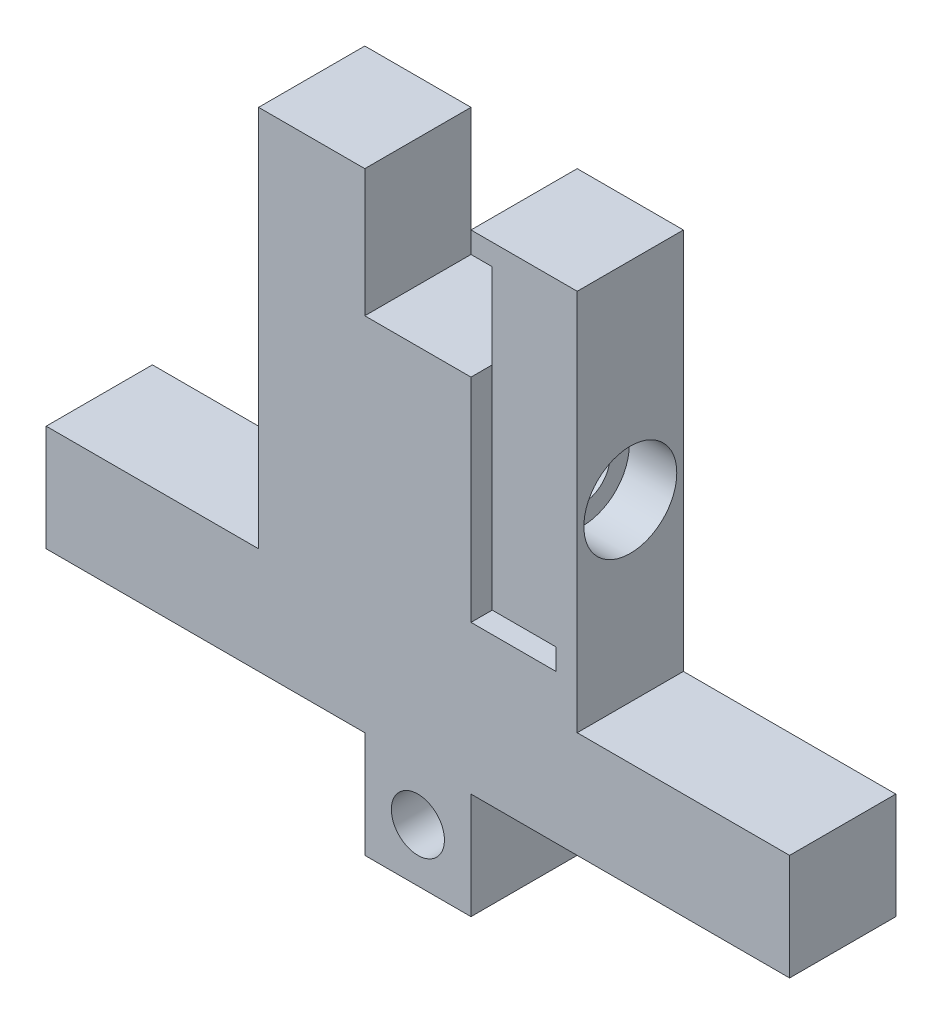
ISO-10303-21;
HEADER;
FILE_DESCRIPTION(('STEP AP214'),'2;1');
FILE_NAME('part.step','',(''),(''),'','','');
FILE_SCHEMA(('AUTOMOTIVE_DESIGN { 1 0 10303 214 1 1 1 1 }'));
ENDSEC;
DATA;
#1=APPLICATION_CONTEXT('core data for automotive mechanical design processes');
#2=APPLICATION_PROTOCOL_DEFINITION('international standard','automotive_design',2000,#1);
#3=PRODUCT_CONTEXT('',#1,'mechanical');
#4=PRODUCT('Part','Part','',(#3));
#5=PRODUCT_RELATED_PRODUCT_CATEGORY('part','',(#4));
#6=PRODUCT_DEFINITION_FORMATION('','',#4);
#7=PRODUCT_DEFINITION_CONTEXT('part definition',#1,'design');
#8=PRODUCT_DEFINITION('design','',#6,#7);
#9=PRODUCT_DEFINITION_SHAPE('','',#8);
#10=(LENGTH_UNIT() NAMED_UNIT(*) SI_UNIT(.MILLI.,.METRE.));
#11=(NAMED_UNIT(*) PLANE_ANGLE_UNIT() SI_UNIT($,.RADIAN.));
#12=(NAMED_UNIT(*) SI_UNIT($,.STERADIAN.) SOLID_ANGLE_UNIT());
#13=UNCERTAINTY_MEASURE_WITH_UNIT(LENGTH_MEASURE(1.E-05),#10,'distance_accuracy_value','');
#14=(GEOMETRIC_REPRESENTATION_CONTEXT(3) GLOBAL_UNCERTAINTY_ASSIGNED_CONTEXT((#13)) GLOBAL_UNIT_ASSIGNED_CONTEXT((#10,
#11,#12)) REPRESENTATION_CONTEXT('',''));
#15=CARTESIAN_POINT('',(0.,0.,0.));
#16=DIRECTION('',(0.,0.,1.));
#17=DIRECTION('',(1.,0.,0.));
#18=AXIS2_PLACEMENT_3D('',#15,#16,#17);
#19=CARTESIAN_POINT('',(-9.525,-15.875,3.175));
#20=DIRECTION('',(0.,1.,0.));
#21=DIRECTION('',(0.,0.,1.));
#22=AXIS2_PLACEMENT_3D('',#19,#20,#21);
#23=PLANE('',#22);
#24=DIRECTION('',(1.,0.,0.));
#25=VECTOR('',#24,1.);
#26=CARTESIAN_POINT('',(-9.525,-15.875,-3.175));
#27=LINE('',#26,#25);
#28=CARTESIAN_POINT('',(-22.225,-15.875,-3.175));
#29=VERTEX_POINT('',#28);
#30=CARTESIAN_POINT('',(-3.175,-15.875,-3.175));
#31=VERTEX_POINT('',#30);
#32=EDGE_CURVE('E45',#29,#31,#27,.T.);
#33=ORIENTED_EDGE('',*,*,#32,.T.);
#34=DIRECTION('',(0.,0.,1.));
#35=VECTOR('',#34,1.);
#36=CARTESIAN_POINT('',(-3.175,-15.875,3.175));
#37=LINE('',#36,#35);
#38=CARTESIAN_POINT('',(-3.175,-15.875,3.175));
#39=VERTEX_POINT('',#38);
#40=EDGE_CURVE('E66',#31,#39,#37,.T.);
#41=ORIENTED_EDGE('',*,*,#40,.T.);
#42=DIRECTION('',(1.,0.,0.));
#43=VECTOR('',#42,1.);
#44=CARTESIAN_POINT('',(-9.525,-15.875,3.175));
#45=LINE('',#44,#43);
#46=CARTESIAN_POINT('',(-22.225,-15.875,3.175));
#47=VERTEX_POINT('',#46);
#48=EDGE_CURVE('E11',#47,#39,#45,.T.);
#49=ORIENTED_EDGE('',*,*,#48,.F.);
#50=DIRECTION('',(0.,0.,1.));
#51=VECTOR('',#50,1.);
#52=CARTESIAN_POINT('',(-22.225,-15.875,-3.175));
#53=LINE('',#52,#51);
#54=EDGE_CURVE('E249',#29,#47,#53,.T.);
#55=ORIENTED_EDGE('',*,*,#54,.F.);
#56=EDGE_LOOP('',(#33,#41,#49,#55));
#57=FACE_BOUND('',#56,.T.);
#58=ADVANCED_FACE('F41',(#57),#23,.F.);
#59=CARTESIAN_POINT('',(9.525,-15.875,3.175));
#60=DIRECTION('',(-1.,0.,0.));
#61=DIRECTION('',(0.,0.,1.));
#62=AXIS2_PLACEMENT_3D('',#59,#60,#61);
#63=PLANE('',#62);
#64=CARTESIAN_POINT('',(9.525,0.952499999999999,0.));
#65=DIRECTION('',(1.,0.,0.));
#66=DIRECTION('',(0.,0.,-1.));
#67=AXIS2_PLACEMENT_3D('',#64,#65,#66);
#68=CIRCLE('',#67,2.77876);
#69=CARTESIAN_POINT('',(9.525,0.952499999999999,-2.77876));
#70=VERTEX_POINT('',#69);
#71=EDGE_CURVE('E294',#70,#70,#68,.T.);
#72=ORIENTED_EDGE('',*,*,#71,.F.);
#73=EDGE_LOOP('',(#72));
#74=FACE_BOUND('',#73,.T.);
#75=DIRECTION('',(0.,0.,1.));
#76=VECTOR('',#75,1.);
#77=CARTESIAN_POINT('',(9.525,-9.525,-3.175));
#78=LINE('',#77,#76);
#79=CARTESIAN_POINT('',(9.525,-9.525,-3.175));
#80=VERTEX_POINT('',#79);
#81=CARTESIAN_POINT('',(9.525,-9.525,3.175));
#82=VERTEX_POINT('',#81);
#83=EDGE_CURVE('E277',#80,#82,#78,.T.);
#84=ORIENTED_EDGE('',*,*,#83,.F.);
#85=DIRECTION('',(0.,1.,0.));
#86=VECTOR('',#85,1.);
#87=CARTESIAN_POINT('',(9.525,-15.875,-3.175));
#88=LINE('',#87,#86);
#89=CARTESIAN_POINT('',(9.525,13.335,-3.175));
#90=VERTEX_POINT('',#89);
#91=EDGE_CURVE('E419',#80,#90,#88,.T.);
#92=ORIENTED_EDGE('',*,*,#91,.T.);
#93=DIRECTION('',(0.,0.,1.));
#94=VECTOR('',#93,1.);
#95=CARTESIAN_POINT('',(9.525,13.335,-3.175));
#96=LINE('',#95,#94);
#97=CARTESIAN_POINT('',(9.525,13.335,3.175));
#98=VERTEX_POINT('',#97);
#99=EDGE_CURVE('E415',#90,#98,#96,.T.);
#100=ORIENTED_EDGE('',*,*,#99,.T.);
#101=DIRECTION('',(0.,1.,0.));
#102=VECTOR('',#101,1.);
#103=CARTESIAN_POINT('',(9.525,-15.875,3.175));
#104=LINE('',#103,#102);
#105=EDGE_CURVE('E434',#82,#98,#104,.T.);
#106=ORIENTED_EDGE('',*,*,#105,.F.);
#107=EDGE_LOOP('',(#84,#92,#100,#106));
#108=FACE_BOUND('',#107,.T.);
#109=ADVANCED_FACE('F43',(#74,#108),#63,.F.);
#110=CARTESIAN_POINT('',(3.175,0.,-3.175));
#111=DIRECTION('',(-1.,0.,0.));
#112=DIRECTION('',(0.,0.,1.));
#113=AXIS2_PLACEMENT_3D('',#110,#111,#112);
#114=PLANE('',#113);
#115=DIRECTION('',(0.,-1.,0.));
#116=VECTOR('',#115,1.);
#117=CARTESIAN_POINT('',(3.175,0.,-3.175));
#118=LINE('',#117,#116);
#119=CARTESIAN_POINT('',(3.175,13.335,-3.175));
#120=VERTEX_POINT('',#119);
#121=CARTESIAN_POINT('',(3.175,12.065,-3.175));
#122=VERTEX_POINT('',#121);
#123=EDGE_CURVE('E388',#120,#122,#118,.T.);
#124=ORIENTED_EDGE('',*,*,#123,.T.);
#125=DIRECTION('',(0.,0.,1.));
#126=VECTOR('',#125,1.);
#127=CARTESIAN_POINT('',(3.175,12.065,-3.175));
#128=LINE('',#127,#126);
#129=CARTESIAN_POINT('',(3.175,12.065,3.175));
#130=VERTEX_POINT('',#129);
#131=EDGE_CURVE('E355',#122,#130,#128,.T.);
#132=ORIENTED_EDGE('',*,*,#131,.T.);
#133=DIRECTION('',(0.,-1.,0.));
#134=VECTOR('',#133,1.);
#135=CARTESIAN_POINT('',(3.175,0.,3.175));
#136=LINE('',#135,#134);
#137=CARTESIAN_POINT('',(3.175,13.335,3.175));
#138=VERTEX_POINT('',#137);
#139=EDGE_CURVE('E408',#138,#130,#136,.T.);
#140=ORIENTED_EDGE('',*,*,#139,.F.);
#141=DIRECTION('',(0.,0.,1.));
#142=VECTOR('',#141,1.);
#143=CARTESIAN_POINT('',(3.175,13.335,-3.175));
#144=LINE('',#143,#142);
#145=EDGE_CURVE('E420',#120,#138,#144,.T.);
#146=ORIENTED_EDGE('',*,*,#145,.F.);
#147=EDGE_LOOP('',(#124,#132,#140,#146));
#148=FACE_BOUND('',#147,.T.);
#149=ADVANCED_FACE('F471',(#148),#114,.T.);
#150=CARTESIAN_POINT('',(-9.525,-15.875,3.175));
#151=DIRECTION('',(1.,0.,0.));
#152=DIRECTION('',(0.,0.,-1.));
#153=AXIS2_PLACEMENT_3D('',#150,#151,#152);
#154=PLANE('',#153);
#155=CARTESIAN_POINT('',(-9.52500000000001,0.952499999999999,0.));
#156=DIRECTION('',(1.,0.,0.));
#157=DIRECTION('',(0.,0.,-1.));
#158=AXIS2_PLACEMENT_3D('',#155,#156,#157);
#159=CIRCLE('',#158,1.1303);
#160=CARTESIAN_POINT('',(-9.52500000000001,0.952499999999999,-1.1303));
#161=VERTEX_POINT('',#160);
#162=EDGE_CURVE('E290',#161,#161,#159,.T.);
#163=ORIENTED_EDGE('',*,*,#162,.T.);
#164=EDGE_LOOP('',(#163));
#165=FACE_BOUND('',#164,.T.);
#166=DIRECTION('',(0.,-1.,0.));
#167=VECTOR('',#166,1.);
#168=CARTESIAN_POINT('',(-9.525,-15.875,-3.175));
#169=LINE('',#168,#167);
#170=CARTESIAN_POINT('',(-9.525,13.335,-3.175));
#171=VERTEX_POINT('',#170);
#172=CARTESIAN_POINT('',(-9.525,-9.525,-3.175));
#173=VERTEX_POINT('',#172);
#174=EDGE_CURVE('E442',#171,#173,#169,.T.);
#175=ORIENTED_EDGE('',*,*,#174,.T.);
#176=DIRECTION('',(0.,0.,1.));
#177=VECTOR('',#176,1.);
#178=CARTESIAN_POINT('',(-9.525,-9.525,-3.175));
#179=LINE('',#178,#177);
#180=CARTESIAN_POINT('',(-9.525,-9.525,3.175));
#181=VERTEX_POINT('',#180);
#182=EDGE_CURVE('E244',#173,#181,#179,.T.);
#183=ORIENTED_EDGE('',*,*,#182,.T.);
#184=DIRECTION('',(0.,-1.,0.));
#185=VECTOR('',#184,1.);
#186=CARTESIAN_POINT('',(-9.525,-15.875,3.175));
#187=LINE('',#186,#185);
#188=CARTESIAN_POINT('',(-9.525,13.335,3.175));
#189=VERTEX_POINT('',#188);
#190=EDGE_CURVE('E437',#189,#181,#187,.T.);
#191=ORIENTED_EDGE('',*,*,#190,.F.);
#192=DIRECTION('',(0.,0.,1.));
#193=VECTOR('',#192,1.);
#194=CARTESIAN_POINT('',(-9.525,13.335,-3.175));
#195=LINE('',#194,#193);
#196=EDGE_CURVE('E396',#171,#189,#195,.T.);
#197=ORIENTED_EDGE('',*,*,#196,.F.);
#198=EDGE_LOOP('',(#175,#183,#191,#197));
#199=FACE_BOUND('',#198,.T.);
#200=ADVANCED_FACE('F463',(#165,#199),#154,.F.);
#201=CARTESIAN_POINT('',(3.175,-15.875,3.175));
#202=VERTEX_POINT('',#201);
#203=CARTESIAN_POINT('',(22.225,-15.875,3.175));
#204=VERTEX_POINT('',#203);
#205=EDGE_CURVE('E51',#202,#204,#45,.T.);
#206=ORIENTED_EDGE('',*,*,#205,.F.);
#207=DIRECTION('',(0.,0.,-1.));
#208=VECTOR('',#207,1.);
#209=CARTESIAN_POINT('',(3.175,-15.875,3.175));
#210=LINE('',#209,#208);
#211=CARTESIAN_POINT('',(3.175,-15.875,-3.175));
#212=VERTEX_POINT('',#211);
#213=EDGE_CURVE('E198',#202,#212,#210,.T.);
#214=ORIENTED_EDGE('',*,*,#213,.T.);
#215=CARTESIAN_POINT('',(22.225,-15.875,-3.175));
#216=VERTEX_POINT('',#215);
#217=EDGE_CURVE('E445',#212,#216,#27,.T.);
#218=ORIENTED_EDGE('',*,*,#217,.T.);
#219=DIRECTION('',(0.,0.,1.));
#220=VECTOR('',#219,1.);
#221=CARTESIAN_POINT('',(22.225,-15.875,-3.175));
#222=LINE('',#221,#220);
#223=EDGE_CURVE('E270',#216,#204,#222,.T.);
#224=ORIENTED_EDGE('',*,*,#223,.T.);
#225=EDGE_LOOP('',(#206,#214,#218,#224));
#226=FACE_BOUND('',#225,.T.);
#227=ADVANCED_FACE('F461',(#226),#23,.F.);
#228=CARTESIAN_POINT('',(0.,0.,3.175));
#229=DIRECTION('',(0.,0.,-1.));
#230=DIRECTION('',(-1.,0.,0.));
#231=AXIS2_PLACEMENT_3D('',#228,#229,#230);
#232=PLANE('',#231);
#233=CARTESIAN_POINT('',(0.,-19.05,3.175));
#234=DIRECTION('',(0.,0.,-1.));
#235=DIRECTION('',(-1.,0.,0.));
#236=AXIS2_PLACEMENT_3D('',#233,#234,#235);
#237=CIRCLE('',#236,1.5875);
#238=CARTESIAN_POINT('',(-1.5875,-19.05,3.175));
#239=VERTEX_POINT('',#238);
#240=EDGE_CURVE('E225',#239,#239,#237,.T.);
#241=ORIENTED_EDGE('',*,*,#240,.T.);
#242=EDGE_LOOP('',(#241));
#243=FACE_BOUND('',#242,.T.);
#244=ORIENTED_EDGE('',*,*,#48,.T.);
#245=DIRECTION('',(0.,1.,0.));
#246=VECTOR('',#245,1.);
#247=CARTESIAN_POINT('',(-3.175,-9.525,3.175));
#248=LINE('',#247,#246);
#249=CARTESIAN_POINT('',(-3.175,-22.225,3.175));
#250=VERTEX_POINT('',#249);
#251=EDGE_CURVE('E203',#250,#39,#248,.T.);
#252=ORIENTED_EDGE('',*,*,#251,.F.);
#253=DIRECTION('',(-1.,0.,0.));
#254=VECTOR('',#253,1.);
#255=CARTESIAN_POINT('',(3.175,-22.225,3.175));
#256=LINE('',#255,#254);
#257=CARTESIAN_POINT('',(3.175,-22.225,3.175));
#258=VERTEX_POINT('',#257);
#259=EDGE_CURVE('E202',#258,#250,#256,.T.);
#260=ORIENTED_EDGE('',*,*,#259,.F.);
#261=DIRECTION('',(0.,-1.,0.));
#262=VECTOR('',#261,1.);
#263=CARTESIAN_POINT('',(3.175,-9.525,3.175));
#264=LINE('',#263,#262);
#265=EDGE_CURVE('E192',#202,#258,#264,.T.);
#266=ORIENTED_EDGE('',*,*,#265,.F.);
#267=ORIENTED_EDGE('',*,*,#205,.T.);
#268=DIRECTION('',(0.,1.,0.));
#269=VECTOR('',#268,1.);
#270=CARTESIAN_POINT('',(22.225,-15.875,3.175));
#271=LINE('',#270,#269);
#272=CARTESIAN_POINT('',(22.225,-9.525,3.175));
#273=VERTEX_POINT('',#272);
#274=EDGE_CURVE('E253',#204,#273,#271,.T.);
#275=ORIENTED_EDGE('',*,*,#274,.T.);
#276=DIRECTION('',(-1.,0.,0.));
#277=VECTOR('',#276,1.);
#278=CARTESIAN_POINT('',(9.525,-9.525,3.175));
#279=LINE('',#278,#277);
#280=EDGE_CURVE('E266',#273,#82,#279,.T.);
#281=ORIENTED_EDGE('',*,*,#280,.T.);
#282=ORIENTED_EDGE('',*,*,#105,.T.);
#283=DIRECTION('',(1.,0.,0.));
#284=VECTOR('',#283,1.);
#285=CARTESIAN_POINT('',(0.,13.335,3.175));
#286=LINE('',#285,#284);
#287=EDGE_CURVE('E380',#138,#98,#286,.T.);
#288=ORIENTED_EDGE('',*,*,#287,.F.);
#289=ORIENTED_EDGE('',*,*,#139,.T.);
#290=DIRECTION('',(1.,0.,0.));
#291=VECTOR('',#290,1.);
#292=CARTESIAN_POINT('',(0.,12.065,3.175));
#293=LINE('',#292,#291);
#294=CARTESIAN_POINT('',(4.445,12.065,3.175));
#295=VERTEX_POINT('',#294);
#296=EDGE_CURVE('E316',#130,#295,#293,.T.);
#297=ORIENTED_EDGE('',*,*,#296,.T.);
#298=DIRECTION('',(0.,-1.,0.));
#299=VECTOR('',#298,1.);
#300=CARTESIAN_POINT('',(4.445,0.,3.175));
#301=LINE('',#300,#299);
#302=CARTESIAN_POINT('',(4.445,-5.715,3.175));
#303=VERTEX_POINT('',#302);
#304=EDGE_CURVE('E348',#295,#303,#301,.T.);
#305=ORIENTED_EDGE('',*,*,#304,.T.);
#306=DIRECTION('',(1.,0.,0.));
#307=VECTOR('',#306,1.);
#308=CARTESIAN_POINT('',(0.,-5.715,3.175));
#309=LINE('',#308,#307);
#310=CARTESIAN_POINT('',(8.255,-5.715,3.175));
#311=VERTEX_POINT('',#310);
#312=EDGE_CURVE('E344',#303,#311,#309,.T.);
#313=ORIENTED_EDGE('',*,*,#312,.T.);
#314=DIRECTION('',(0.,1.,0.));
#315=VECTOR('',#314,1.);
#316=CARTESIAN_POINT('',(8.255,0.,3.175));
#317=LINE('',#316,#315);
#318=CARTESIAN_POINT('',(8.255,-6.985,3.175));
#319=VERTEX_POINT('',#318);
#320=EDGE_CURVE('E340',#319,#311,#317,.T.);
#321=ORIENTED_EDGE('',*,*,#320,.F.);
#322=DIRECTION('',(1.,0.,0.));
#323=VECTOR('',#322,1.);
#324=CARTESIAN_POINT('',(0.,-6.985,3.175));
#325=LINE('',#324,#323);
#326=CARTESIAN_POINT('',(3.175,-6.985,3.175));
#327=VERTEX_POINT('',#326);
#328=EDGE_CURVE('E336',#327,#319,#325,.T.);
#329=ORIENTED_EDGE('',*,*,#328,.F.);
#330=DIRECTION('',(0.,-1.,0.));
#331=VECTOR('',#330,1.);
#332=CARTESIAN_POINT('',(3.175,0.,3.175));
#333=LINE('',#332,#331);
#334=CARTESIAN_POINT('',(3.175,5.715,3.175));
#335=VERTEX_POINT('',#334);
#336=EDGE_CURVE('E310',#335,#327,#333,.T.);
#337=ORIENTED_EDGE('',*,*,#336,.F.);
#338=DIRECTION('',(1.,0.,0.));
#339=VECTOR('',#338,1.);
#340=CARTESIAN_POINT('',(0.,5.715,3.175));
#341=LINE('',#340,#339);
#342=CARTESIAN_POINT('',(-3.175,5.715,3.175));
#343=VERTEX_POINT('',#342);
#344=EDGE_CURVE('E404',#343,#335,#341,.T.);
#345=ORIENTED_EDGE('',*,*,#344,.F.);
#346=DIRECTION('',(0.,-1.,0.));
#347=VECTOR('',#346,1.);
#348=CARTESIAN_POINT('',(-3.175,0.,3.175));
#349=LINE('',#348,#347);
#350=CARTESIAN_POINT('',(-3.175,13.335,3.175));
#351=VERTEX_POINT('',#350);
#352=EDGE_CURVE('E400',#351,#343,#349,.T.);
#353=ORIENTED_EDGE('',*,*,#352,.F.);
#354=DIRECTION('',(1.,0.,0.));
#355=VECTOR('',#354,1.);
#356=CARTESIAN_POINT('',(0.,13.335,3.175));
#357=LINE('',#356,#355);
#358=EDGE_CURVE('E359',#189,#351,#357,.T.);
#359=ORIENTED_EDGE('',*,*,#358,.F.);
#360=ORIENTED_EDGE('',*,*,#190,.T.);
#361=DIRECTION('',(1.,0.,0.));
#362=VECTOR('',#361,1.);
#363=CARTESIAN_POINT('',(-9.525,-9.525,3.175));
#364=LINE('',#363,#362);
#365=CARTESIAN_POINT('',(-22.225,-9.525,3.175));
#366=VERTEX_POINT('',#365);
#367=EDGE_CURVE('E236',#366,#181,#364,.T.);
#368=ORIENTED_EDGE('',*,*,#367,.F.);
#369=DIRECTION('',(0.,1.,0.));
#370=VECTOR('',#369,1.);
#371=CARTESIAN_POINT('',(-22.225,-15.875,3.175));
#372=LINE('',#371,#370);
#373=EDGE_CURVE('E241',#47,#366,#372,.T.);
#374=ORIENTED_EDGE('',*,*,#373,.F.);
#375=EDGE_LOOP('',(#244,#252,#260,#266,#267,#275,#281,#282,#288,#289,#297,#305,#313,#321,#329,
#337,#345,#353,#359,#360,#368,#374));
#376=FACE_BOUND('',#375,.T.);
#377=ADVANCED_FACE('F214',(#243,#376),#232,.F.);
#378=CARTESIAN_POINT('',(0.,0.,-3.175));
#379=DIRECTION('',(0.,0.,-1.));
#380=DIRECTION('',(-1.,0.,0.));
#381=AXIS2_PLACEMENT_3D('',#378,#379,#380);
#382=PLANE('',#381);
#383=CARTESIAN_POINT('',(0.,-19.05,-3.175));
#384=DIRECTION('',(0.,0.,-1.));
#385=DIRECTION('',(-1.,0.,0.));
#386=AXIS2_PLACEMENT_3D('',#383,#384,#385);
#387=CIRCLE('',#386,1.5875);
#388=CARTESIAN_POINT('',(-1.5875,-19.05,-3.175));
#389=VERTEX_POINT('',#388);
#390=EDGE_CURVE('E566',#389,#389,#387,.T.);
#391=ORIENTED_EDGE('',*,*,#390,.F.);
#392=EDGE_LOOP('',(#391));
#393=FACE_BOUND('',#392,.T.);
#394=ORIENTED_EDGE('',*,*,#217,.F.);
#395=DIRECTION('',(0.,-1.,0.));
#396=VECTOR('',#395,1.);
#397=CARTESIAN_POINT('',(3.175,-9.525,-3.175));
#398=LINE('',#397,#396);
#399=CARTESIAN_POINT('',(3.175,-22.225,-3.175));
#400=VERTEX_POINT('',#399);
#401=EDGE_CURVE('E224',#212,#400,#398,.T.);
#402=ORIENTED_EDGE('',*,*,#401,.T.);
#403=DIRECTION('',(-1.,0.,0.));
#404=VECTOR('',#403,1.);
#405=CARTESIAN_POINT('',(3.175,-22.225,-3.175));
#406=LINE('',#405,#404);
#407=CARTESIAN_POINT('',(-3.175,-22.225,-3.175));
#408=VERTEX_POINT('',#407);
#409=EDGE_CURVE('E209',#400,#408,#406,.T.);
#410=ORIENTED_EDGE('',*,*,#409,.T.);
#411=DIRECTION('',(0.,1.,0.));
#412=VECTOR('',#411,1.);
#413=CARTESIAN_POINT('',(-3.175,-9.525,-3.175));
#414=LINE('',#413,#412);
#415=EDGE_CURVE('E220',#408,#31,#414,.T.);
#416=ORIENTED_EDGE('',*,*,#415,.T.);
#417=ORIENTED_EDGE('',*,*,#32,.F.);
#418=DIRECTION('',(0.,1.,0.));
#419=VECTOR('',#418,1.);
#420=CARTESIAN_POINT('',(-22.225,-15.875,-3.175));
#421=LINE('',#420,#419);
#422=CARTESIAN_POINT('',(-22.225,-9.525,-3.175));
#423=VERTEX_POINT('',#422);
#424=EDGE_CURVE('E240',#29,#423,#421,.T.);
#425=ORIENTED_EDGE('',*,*,#424,.T.);
#426=DIRECTION('',(1.,0.,0.));
#427=VECTOR('',#426,1.);
#428=CARTESIAN_POINT('',(-9.525,-9.525,-3.175));
#429=LINE('',#428,#427);
#430=EDGE_CURVE('E237',#423,#173,#429,.T.);
#431=ORIENTED_EDGE('',*,*,#430,.T.);
#432=ORIENTED_EDGE('',*,*,#174,.F.);
#433=DIRECTION('',(1.,0.,0.));
#434=VECTOR('',#433,1.);
#435=CARTESIAN_POINT('',(0.,13.335,-3.175));
#436=LINE('',#435,#434);
#437=CARTESIAN_POINT('',(-3.175,13.335,-3.175));
#438=VERTEX_POINT('',#437);
#439=EDGE_CURVE('E375',#171,#438,#436,.T.);
#440=ORIENTED_EDGE('',*,*,#439,.T.);
#441=DIRECTION('',(0.,-1.,0.));
#442=VECTOR('',#441,1.);
#443=CARTESIAN_POINT('',(-3.175,0.,-3.175));
#444=LINE('',#443,#442);
#445=CARTESIAN_POINT('',(-3.175,5.715,-3.175));
#446=VERTEX_POINT('',#445);
#447=EDGE_CURVE('E379',#438,#446,#444,.T.);
#448=ORIENTED_EDGE('',*,*,#447,.T.);
#449=DIRECTION('',(1.,0.,0.));
#450=VECTOR('',#449,1.);
#451=CARTESIAN_POINT('',(0.,5.715,-3.175));
#452=LINE('',#451,#450);
#453=CARTESIAN_POINT('',(3.175,5.715,-3.175));
#454=VERTEX_POINT('',#453);
#455=EDGE_CURVE('E384',#446,#454,#452,.T.);
#456=ORIENTED_EDGE('',*,*,#455,.T.);
#457=DIRECTION('',(0.,-1.,0.));
#458=VECTOR('',#457,1.);
#459=CARTESIAN_POINT('',(3.175,0.,-3.175));
#460=LINE('',#459,#458);
#461=CARTESIAN_POINT('',(3.175,-6.985,-3.175));
#462=VERTEX_POINT('',#461);
#463=EDGE_CURVE('E311',#454,#462,#460,.T.);
#464=ORIENTED_EDGE('',*,*,#463,.T.);
#465=DIRECTION('',(1.,0.,0.));
#466=VECTOR('',#465,1.);
#467=CARTESIAN_POINT('',(0.,-6.985,-3.175));
#468=LINE('',#467,#466);
#469=CARTESIAN_POINT('',(8.255,-6.985,-3.175));
#470=VERTEX_POINT('',#469);
#471=EDGE_CURVE('E315',#462,#470,#468,.T.);
#472=ORIENTED_EDGE('',*,*,#471,.T.);
#473=DIRECTION('',(0.,1.,0.));
#474=VECTOR('',#473,1.);
#475=CARTESIAN_POINT('',(8.255,0.,-3.175));
#476=LINE('',#475,#474);
#477=CARTESIAN_POINT('',(8.255,-5.715,-3.175));
#478=VERTEX_POINT('',#477);
#479=EDGE_CURVE('E320',#470,#478,#476,.T.);
#480=ORIENTED_EDGE('',*,*,#479,.T.);
#481=DIRECTION('',(1.,0.,0.));
#482=VECTOR('',#481,1.);
#483=CARTESIAN_POINT('',(0.,-5.715,-3.175));
#484=LINE('',#483,#482);
#485=CARTESIAN_POINT('',(4.445,-5.715,-3.175));
#486=VERTEX_POINT('',#485);
#487=EDGE_CURVE('E324',#486,#478,#484,.T.);
#488=ORIENTED_EDGE('',*,*,#487,.F.);
#489=DIRECTION('',(0.,-1.,0.));
#490=VECTOR('',#489,1.);
#491=CARTESIAN_POINT('',(4.445,0.,-3.175));
#492=LINE('',#491,#490);
#493=CARTESIAN_POINT('',(4.445,12.065,-3.175));
#494=VERTEX_POINT('',#493);
#495=EDGE_CURVE('E327',#494,#486,#492,.T.);
#496=ORIENTED_EDGE('',*,*,#495,.F.);
#497=DIRECTION('',(1.,0.,0.));
#498=VECTOR('',#497,1.);
#499=CARTESIAN_POINT('',(0.,12.065,-3.175));
#500=LINE('',#499,#498);
#501=EDGE_CURVE('E330',#122,#494,#500,.T.);
#502=ORIENTED_EDGE('',*,*,#501,.F.);
#503=ORIENTED_EDGE('',*,*,#123,.F.);
#504=DIRECTION('',(1.,0.,0.));
#505=VECTOR('',#504,1.);
#506=CARTESIAN_POINT('',(0.,13.335,-3.175));
#507=LINE('',#506,#505);
#508=EDGE_CURVE('E392',#120,#90,#507,.T.);
#509=ORIENTED_EDGE('',*,*,#508,.T.);
#510=ORIENTED_EDGE('',*,*,#91,.F.);
#511=DIRECTION('',(-1.,0.,0.));
#512=VECTOR('',#511,1.);
#513=CARTESIAN_POINT('',(9.525,-9.525,-3.175));
#514=LINE('',#513,#512);
#515=CARTESIAN_POINT('',(22.225,-9.525,-3.175));
#516=VERTEX_POINT('',#515);
#517=EDGE_CURVE('E265',#516,#80,#514,.T.);
#518=ORIENTED_EDGE('',*,*,#517,.F.);
#519=DIRECTION('',(0.,1.,0.));
#520=VECTOR('',#519,1.);
#521=CARTESIAN_POINT('',(22.225,-15.875,-3.175));
#522=LINE('',#521,#520);
#523=EDGE_CURVE('E261',#216,#516,#522,.T.);
#524=ORIENTED_EDGE('',*,*,#523,.F.);
#525=EDGE_LOOP('',(#394,#402,#410,#416,#417,#425,#431,#432,#440,#448,#456,#464,#472,#480,#488,
#496,#502,#503,#509,#510,#518,#524));
#526=FACE_BOUND('',#525,.T.);
#527=ADVANCED_FACE('F458',(#393,#526),#382,.T.);
#528=CARTESIAN_POINT('',(0.,13.335,-3.175));
#529=DIRECTION('',(0.,-1.,0.));
#530=DIRECTION('',(0.,0.,-1.));
#531=AXIS2_PLACEMENT_3D('',#528,#529,#530);
#532=PLANE('',#531);
#533=ORIENTED_EDGE('',*,*,#287,.T.);
#534=ORIENTED_EDGE('',*,*,#99,.F.);
#535=ORIENTED_EDGE('',*,*,#508,.F.);
#536=ORIENTED_EDGE('',*,*,#145,.T.);
#537=EDGE_LOOP('',(#533,#534,#535,#536));
#538=FACE_BOUND('',#537,.T.);
#539=ADVANCED_FACE('F499',(#538),#532,.F.);
#540=CARTESIAN_POINT('',(0.,5.715,-3.175));
#541=DIRECTION('',(0.,-1.,0.));
#542=DIRECTION('',(0.,0.,-1.));
#543=AXIS2_PLACEMENT_3D('',#540,#541,#542);
#544=PLANE('',#543);
#545=ORIENTED_EDGE('',*,*,#344,.T.);
#546=DIRECTION('',(0.,0.,1.));
#547=VECTOR('',#546,1.);
#548=CARTESIAN_POINT('',(3.175,5.715,-3.175));
#549=LINE('',#548,#547);
#550=EDGE_CURVE('E423',#454,#335,#549,.T.);
#551=ORIENTED_EDGE('',*,*,#550,.F.);
#552=ORIENTED_EDGE('',*,*,#455,.F.);
#553=DIRECTION('',(0.,0.,1.));
#554=VECTOR('',#553,1.);
#555=CARTESIAN_POINT('',(-3.175,5.715,-3.175));
#556=LINE('',#555,#554);
#557=EDGE_CURVE('E426',#446,#343,#556,.T.);
#558=ORIENTED_EDGE('',*,*,#557,.T.);
#559=EDGE_LOOP('',(#545,#551,#552,#558));
#560=FACE_BOUND('',#559,.T.);
#561=ADVANCED_FACE('F530',(#560),#544,.F.);
#562=CARTESIAN_POINT('',(-3.175,0.,-3.175));
#563=DIRECTION('',(-1.,0.,0.));
#564=DIRECTION('',(0.,-1.,0.));
#565=AXIS2_PLACEMENT_3D('',#562,#563,#564);
#566=PLANE('',#565);
#567=ORIENTED_EDGE('',*,*,#352,.T.);
#568=ORIENTED_EDGE('',*,*,#557,.F.);
#569=ORIENTED_EDGE('',*,*,#447,.F.);
#570=DIRECTION('',(0.,0.,1.));
#571=VECTOR('',#570,1.);
#572=CARTESIAN_POINT('',(-3.175,13.335,-3.175));
#573=LINE('',#572,#571);
#574=EDGE_CURVE('E429',#438,#351,#573,.T.);
#575=ORIENTED_EDGE('',*,*,#574,.T.);
#576=EDGE_LOOP('',(#567,#568,#569,#575));
#577=FACE_BOUND('',#576,.T.);
#578=ADVANCED_FACE('F533',(#577),#566,.F.);
#579=CARTESIAN_POINT('',(0.,13.335,-3.175));
#580=DIRECTION('',(0.,-1.,0.));
#581=DIRECTION('',(0.,0.,-1.));
#582=AXIS2_PLACEMENT_3D('',#579,#580,#581);
#583=PLANE('',#582);
#584=ORIENTED_EDGE('',*,*,#358,.T.);
#585=ORIENTED_EDGE('',*,*,#574,.F.);
#586=ORIENTED_EDGE('',*,*,#439,.F.);
#587=ORIENTED_EDGE('',*,*,#196,.T.);
#588=EDGE_LOOP('',(#584,#585,#586,#587));
#589=FACE_BOUND('',#588,.T.);
#590=ADVANCED_FACE('F547',(#589),#583,.F.);
#591=CARTESIAN_POINT('',(3.175,0.,-3.175));
#592=DIRECTION('',(-1.,0.,0.));
#593=DIRECTION('',(0.,-1.,0.));
#594=AXIS2_PLACEMENT_3D('',#591,#592,#593);
#595=PLANE('',#594);
#596=CARTESIAN_POINT('',(3.175,0.952499999999999,0.));
#597=DIRECTION('',(1.,0.,0.));
#598=DIRECTION('',(0.,0.,-1.));
#599=AXIS2_PLACEMENT_3D('',#596,#597,#598);
#600=CIRCLE('',#599,1.13029999999999);
#601=CARTESIAN_POINT('',(3.175,0.952499999999999,-1.13029999999999));
#602=VERTEX_POINT('',#601);
#603=EDGE_CURVE('E281',#602,#602,#600,.T.);
#604=ORIENTED_EDGE('',*,*,#603,.F.);
#605=EDGE_LOOP('',(#604));
#606=FACE_BOUND('',#605,.T.);
#607=ORIENTED_EDGE('',*,*,#336,.T.);
#608=DIRECTION('',(0.,0.,1.));
#609=VECTOR('',#608,1.);
#610=CARTESIAN_POINT('',(3.175,-6.985,-3.175));
#611=LINE('',#610,#609);
#612=EDGE_CURVE('E333',#462,#327,#611,.T.);
#613=ORIENTED_EDGE('',*,*,#612,.F.);
#614=ORIENTED_EDGE('',*,*,#463,.F.);
#615=ORIENTED_EDGE('',*,*,#550,.T.);
#616=EDGE_LOOP('',(#607,#613,#614,#615));
#617=FACE_BOUND('',#616,.T.);
#618=ADVANCED_FACE('F525',(#606,#617),#595,.F.);
#619=CARTESIAN_POINT('',(0.,12.065,-3.175));
#620=DIRECTION('',(0.,-1.,0.));
#621=DIRECTION('',(0.,0.,-1.));
#622=AXIS2_PLACEMENT_3D('',#619,#620,#621);
#623=PLANE('',#622);
#624=ORIENTED_EDGE('',*,*,#296,.F.);
#625=ORIENTED_EDGE('',*,*,#131,.F.);
#626=ORIENTED_EDGE('',*,*,#501,.T.);
#627=DIRECTION('',(0.,0.,1.));
#628=VECTOR('',#627,1.);
#629=CARTESIAN_POINT('',(4.445,12.065,-3.175));
#630=LINE('',#629,#628);
#631=EDGE_CURVE('E360',#494,#295,#630,.T.);
#632=ORIENTED_EDGE('',*,*,#631,.T.);
#633=EDGE_LOOP('',(#624,#625,#626,#632));
#634=FACE_BOUND('',#633,.T.);
#635=ADVANCED_FACE('F503',(#634),#623,.T.);
#636=CARTESIAN_POINT('',(4.445,0.,-3.175));
#637=DIRECTION('',(-1.,0.,0.));
#638=DIRECTION('',(0.,-1.,0.));
#639=AXIS2_PLACEMENT_3D('',#636,#637,#638);
#640=PLANE('',#639);
#641=CARTESIAN_POINT('',(4.445,0.952499999999999,0.));
#642=DIRECTION('',(-1.,0.,0.));
#643=DIRECTION('',(0.,-1.,0.));
#644=AXIS2_PLACEMENT_3D('',#641,#642,#643);
#645=CIRCLE('',#644,1.63195);
#646=CARTESIAN_POINT('',(4.445,-0.67945,0.));
#647=VERTEX_POINT('',#646);
#648=EDGE_CURVE('E306',#647,#647,#645,.T.);
#649=ORIENTED_EDGE('',*,*,#648,.F.);
#650=EDGE_LOOP('',(#649));
#651=FACE_BOUND('',#650,.T.);
#652=ORIENTED_EDGE('',*,*,#304,.F.);
#653=ORIENTED_EDGE('',*,*,#631,.F.);
#654=ORIENTED_EDGE('',*,*,#495,.T.);
#655=DIRECTION('',(0.,0.,1.));
#656=VECTOR('',#655,1.);
#657=CARTESIAN_POINT('',(4.445,-5.715,-3.175));
#658=LINE('',#657,#656);
#659=EDGE_CURVE('E363',#486,#303,#658,.T.);
#660=ORIENTED_EDGE('',*,*,#659,.T.);
#661=EDGE_LOOP('',(#652,#653,#654,#660));
#662=FACE_BOUND('',#661,.T.);
#663=ADVANCED_FACE('F508',(#651,#662),#640,.T.);
#664=CARTESIAN_POINT('',(0.,-5.715,-3.175));
#665=DIRECTION('',(0.,-1.,0.));
#666=DIRECTION('',(0.,0.,-1.));
#667=AXIS2_PLACEMENT_3D('',#664,#665,#666);
#668=PLANE('',#667);
#669=ORIENTED_EDGE('',*,*,#312,.F.);
#670=ORIENTED_EDGE('',*,*,#659,.F.);
#671=ORIENTED_EDGE('',*,*,#487,.T.);
#672=DIRECTION('',(0.,0.,1.));
#673=VECTOR('',#672,1.);
#674=CARTESIAN_POINT('',(8.255,-5.715,-3.175));
#675=LINE('',#674,#673);
#676=EDGE_CURVE('E366',#478,#311,#675,.T.);
#677=ORIENTED_EDGE('',*,*,#676,.T.);
#678=EDGE_LOOP('',(#669,#670,#671,#677));
#679=FACE_BOUND('',#678,.T.);
#680=ADVANCED_FACE('F513',(#679),#668,.T.);
#681=CARTESIAN_POINT('',(8.255,0.,-3.175));
#682=DIRECTION('',(1.,0.,0.));
#683=DIRECTION('',(0.,0.,-1.));
#684=AXIS2_PLACEMENT_3D('',#681,#682,#683);
#685=PLANE('',#684);
#686=ORIENTED_EDGE('',*,*,#320,.T.);
#687=ORIENTED_EDGE('',*,*,#676,.F.);
#688=ORIENTED_EDGE('',*,*,#479,.F.);
#689=DIRECTION('',(0.,0.,1.));
#690=VECTOR('',#689,1.);
#691=CARTESIAN_POINT('',(8.255,-6.985,-3.175));
#692=LINE('',#691,#690);
#693=EDGE_CURVE('E369',#470,#319,#692,.T.);
#694=ORIENTED_EDGE('',*,*,#693,.T.);
#695=EDGE_LOOP('',(#686,#687,#688,#694));
#696=FACE_BOUND('',#695,.T.);
#697=ADVANCED_FACE('F519',(#696),#685,.F.);
#698=CARTESIAN_POINT('',(0.,-6.985,-3.175));
#699=DIRECTION('',(0.,-1.,0.));
#700=DIRECTION('',(0.,0.,-1.));
#701=AXIS2_PLACEMENT_3D('',#698,#699,#700);
#702=PLANE('',#701);
#703=ORIENTED_EDGE('',*,*,#328,.T.);
#704=ORIENTED_EDGE('',*,*,#693,.F.);
#705=ORIENTED_EDGE('',*,*,#471,.F.);
#706=ORIENTED_EDGE('',*,*,#612,.T.);
#707=EDGE_LOOP('',(#703,#704,#705,#706));
#708=FACE_BOUND('',#707,.T.);
#709=ADVANCED_FACE('F523',(#708),#702,.F.);
#710=CARTESIAN_POINT('',(9.525,0.952499999999999,0.));
#711=DIRECTION('',(1.,0.,0.));
#712=DIRECTION('',(0.,0.,-1.));
#713=AXIS2_PLACEMENT_3D('',#710,#711,#712);
#714=CYLINDRICAL_SURFACE('',#713,1.63195);
#715=CARTESIAN_POINT('',(6.6802,0.952499999999999,0.));
#716=DIRECTION('',(1.,0.,0.));
#717=DIRECTION('',(0.,0.,-1.));
#718=AXIS2_PLACEMENT_3D('',#715,#716,#717);
#719=CIRCLE('',#718,1.63195);
#720=CARTESIAN_POINT('',(6.6802,0.952499999999999,-1.63195));
#721=VERTEX_POINT('',#720);
#722=EDGE_CURVE('E302',#721,#721,#719,.T.);
#723=ORIENTED_EDGE('',*,*,#722,.T.);
#724=EDGE_LOOP('',(#723));
#725=FACE_BOUND('',#724,.T.);
#726=ORIENTED_EDGE('',*,*,#648,.T.);
#727=EDGE_LOOP('',(#726));
#728=FACE_BOUND('',#727,.T.);
#729=ADVANCED_FACE('F607',(#725,#728),#714,.F.);
#730=CARTESIAN_POINT('',(6.6802,2.58445,0.));
#731=DIRECTION('',(-1.,0.,0.));
#732=DIRECTION('',(0.,0.,1.));
#733=AXIS2_PLACEMENT_3D('',#730,#731,#732);
#734=PLANE('',#733);
#735=ORIENTED_EDGE('',*,*,#722,.F.);
#736=EDGE_LOOP('',(#735));
#737=FACE_BOUND('',#736,.T.);
#738=CARTESIAN_POINT('',(6.6802,0.952499999999999,0.));
#739=DIRECTION('',(1.,0.,0.));
#740=DIRECTION('',(0.,0.,-1.));
#741=AXIS2_PLACEMENT_3D('',#738,#739,#740);
#742=CIRCLE('',#741,2.77876);
#743=CARTESIAN_POINT('',(6.6802,0.952499999999999,-2.77876));
#744=VERTEX_POINT('',#743);
#745=EDGE_CURVE('E298',#744,#744,#742,.T.);
#746=ORIENTED_EDGE('',*,*,#745,.T.);
#747=EDGE_LOOP('',(#746));
#748=FACE_BOUND('',#747,.T.);
#749=ADVANCED_FACE('F603',(#737,#748),#734,.F.);
#750=CARTESIAN_POINT('',(9.525,0.952499999999999,0.));
#751=DIRECTION('',(1.,0.,0.));
#752=DIRECTION('',(0.,0.,-1.));
#753=AXIS2_PLACEMENT_3D('',#750,#751,#752);
#754=CYLINDRICAL_SURFACE('',#753,2.77876);
#755=ORIENTED_EDGE('',*,*,#745,.F.);
#756=EDGE_LOOP('',(#755));
#757=FACE_BOUND('',#756,.T.);
#758=ORIENTED_EDGE('',*,*,#71,.T.);
#759=EDGE_LOOP('',(#758));
#760=FACE_BOUND('',#759,.T.);
#761=ADVANCED_FACE('F599',(#757,#760),#754,.F.);
#762=CARTESIAN_POINT('',(3.175,0.952499999999999,0.));
#763=DIRECTION('',(1.,0.,0.));
#764=DIRECTION('',(0.,0.,-1.));
#765=AXIS2_PLACEMENT_3D('',#762,#763,#764);
#766=CYLINDRICAL_SURFACE('',#765,1.13029999999999);
#767=ORIENTED_EDGE('',*,*,#162,.F.);
#768=EDGE_LOOP('',(#767));
#769=FACE_BOUND('',#768,.T.);
#770=ORIENTED_EDGE('',*,*,#603,.T.);
#771=EDGE_LOOP('',(#770));
#772=FACE_BOUND('',#771,.T.);
#773=ADVANCED_FACE('F594',(#769,#772),#766,.F.);
#774=CARTESIAN_POINT('',(9.525,-9.525,-3.175));
#775=DIRECTION('',(0.,1.,0.));
#776=DIRECTION('',(0.,0.,1.));
#777=AXIS2_PLACEMENT_3D('',#774,#775,#776);
#778=PLANE('',#777);
#779=ORIENTED_EDGE('',*,*,#280,.F.);
#780=DIRECTION('',(0.,0.,1.));
#781=VECTOR('',#780,1.);
#782=CARTESIAN_POINT('',(22.225,-9.525,-3.175));
#783=LINE('',#782,#781);
#784=EDGE_CURVE('E282',#516,#273,#783,.T.);
#785=ORIENTED_EDGE('',*,*,#784,.F.);
#786=ORIENTED_EDGE('',*,*,#517,.T.);
#787=ORIENTED_EDGE('',*,*,#83,.T.);
#788=EDGE_LOOP('',(#779,#785,#786,#787));
#789=FACE_BOUND('',#788,.T.);
#790=ADVANCED_FACE('F492',(#789),#778,.T.);
#791=CARTESIAN_POINT('',(22.225,-15.875,-3.175));
#792=DIRECTION('',(1.,0.,0.));
#793=DIRECTION('',(0.,0.,-1.));
#794=AXIS2_PLACEMENT_3D('',#791,#792,#793);
#795=PLANE('',#794);
#796=ORIENTED_EDGE('',*,*,#274,.F.);
#797=ORIENTED_EDGE('',*,*,#223,.F.);
#798=ORIENTED_EDGE('',*,*,#523,.T.);
#799=ORIENTED_EDGE('',*,*,#784,.T.);
#800=EDGE_LOOP('',(#796,#797,#798,#799));
#801=FACE_BOUND('',#800,.T.);
#802=ADVANCED_FACE('F495',(#801),#795,.T.);
#803=CARTESIAN_POINT('',(-22.225,-15.875,-3.175));
#804=DIRECTION('',(1.,0.,0.));
#805=DIRECTION('',(0.,0.,-1.));
#806=AXIS2_PLACEMENT_3D('',#803,#804,#805);
#807=PLANE('',#806);
#808=ORIENTED_EDGE('',*,*,#373,.T.);
#809=DIRECTION('',(0.,0.,1.));
#810=VECTOR('',#809,1.);
#811=CARTESIAN_POINT('',(-22.225,-9.525,-3.175));
#812=LINE('',#811,#810);
#813=EDGE_CURVE('E254',#423,#366,#812,.T.);
#814=ORIENTED_EDGE('',*,*,#813,.F.);
#815=ORIENTED_EDGE('',*,*,#424,.F.);
#816=ORIENTED_EDGE('',*,*,#54,.T.);
#817=EDGE_LOOP('',(#808,#814,#815,#816));
#818=FACE_BOUND('',#817,.T.);
#819=ADVANCED_FACE('F546',(#818),#807,.F.);
#820=CARTESIAN_POINT('',(-9.525,-9.525,-3.175));
#821=DIRECTION('',(0.,-1.,0.));
#822=DIRECTION('',(0.,0.,-1.));
#823=AXIS2_PLACEMENT_3D('',#820,#821,#822);
#824=PLANE('',#823);
#825=ORIENTED_EDGE('',*,*,#367,.T.);
#826=ORIENTED_EDGE('',*,*,#182,.F.);
#827=ORIENTED_EDGE('',*,*,#430,.F.);
#828=ORIENTED_EDGE('',*,*,#813,.T.);
#829=EDGE_LOOP('',(#825,#826,#827,#828));
#830=FACE_BOUND('',#829,.T.);
#831=ADVANCED_FACE('F542',(#830),#824,.F.);
#832=CARTESIAN_POINT('',(-3.175,-9.525,3.175));
#833=DIRECTION('',(-1.,0.,0.));
#834=DIRECTION('',(0.,-1.,0.));
#835=AXIS2_PLACEMENT_3D('',#832,#833,#834);
#836=PLANE('',#835);
#837=ORIENTED_EDGE('',*,*,#40,.F.);
#838=ORIENTED_EDGE('',*,*,#415,.F.);
#839=DIRECTION('',(0.,0.,-1.));
#840=VECTOR('',#839,1.);
#841=CARTESIAN_POINT('',(-3.175,-22.225,3.175));
#842=LINE('',#841,#840);
#843=EDGE_CURVE('E211',#250,#408,#842,.T.);
#844=ORIENTED_EDGE('',*,*,#843,.F.);
#845=ORIENTED_EDGE('',*,*,#251,.T.);
#846=EDGE_LOOP('',(#837,#838,#844,#845));
#847=FACE_BOUND('',#846,.T.);
#848=ADVANCED_FACE('F457',(#847),#836,.T.);
#849=CARTESIAN_POINT('',(3.175,-9.525,3.175));
#850=DIRECTION('',(1.,0.,0.));
#851=DIRECTION('',(0.,1.,0.));
#852=AXIS2_PLACEMENT_3D('',#849,#850,#851);
#853=PLANE('',#852);
#854=ORIENTED_EDGE('',*,*,#213,.F.);
#855=ORIENTED_EDGE('',*,*,#265,.T.);
#856=DIRECTION('',(0.,0.,-1.));
#857=VECTOR('',#856,1.);
#858=CARTESIAN_POINT('',(3.175,-22.225,3.175));
#859=LINE('',#858,#857);
#860=EDGE_CURVE('E196',#258,#400,#859,.T.);
#861=ORIENTED_EDGE('',*,*,#860,.T.);
#862=ORIENTED_EDGE('',*,*,#401,.F.);
#863=EDGE_LOOP('',(#854,#855,#861,#862));
#864=FACE_BOUND('',#863,.T.);
#865=ADVANCED_FACE('F194',(#864),#853,.T.);
#866=CARTESIAN_POINT('',(3.175,-22.225,3.175));
#867=DIRECTION('',(0.,-1.,0.));
#868=DIRECTION('',(0.,0.,-1.));
#869=AXIS2_PLACEMENT_3D('',#866,#867,#868);
#870=PLANE('',#869);
#871=ORIENTED_EDGE('',*,*,#409,.F.);
#872=ORIENTED_EDGE('',*,*,#860,.F.);
#873=ORIENTED_EDGE('',*,*,#259,.T.);
#874=ORIENTED_EDGE('',*,*,#843,.T.);
#875=EDGE_LOOP('',(#871,#872,#873,#874));
#876=FACE_BOUND('',#875,.T.);
#877=ADVANCED_FACE('F207',(#876),#870,.T.);
#878=CARTESIAN_POINT('',(0.,-19.05,3.175));
#879=DIRECTION('',(0.,0.,-1.));
#880=DIRECTION('',(-1.,0.,0.));
#881=AXIS2_PLACEMENT_3D('',#878,#879,#880);
#882=CYLINDRICAL_SURFACE('',#881,1.5875);
#883=ORIENTED_EDGE('',*,*,#240,.F.);
#884=EDGE_LOOP('',(#883));
#885=FACE_BOUND('',#884,.T.);
#886=ORIENTED_EDGE('',*,*,#390,.T.);
#887=EDGE_LOOP('',(#886));
#888=FACE_BOUND('',#887,.T.);
#889=ADVANCED_FACE('F576',(#885,#888),#882,.F.);
#890=CLOSED_SHELL('',(#58,#109,#149,#200,#227,#377,#527,#539,#561,#578,#590,#618,#635,#663,#680,
#697,#709,#729,#749,#761,#773,#790,#802,#819,#831,#848,#865,#877,#889));
#891=MANIFOLD_SOLID_BREP('B2',#890);
#892=ADVANCED_BREP_SHAPE_REPRESENTATION('',(#18,#891),#14);
#893=SHAPE_DEFINITION_REPRESENTATION(#9,#892);
ENDSEC;
END-ISO-10303-21;
